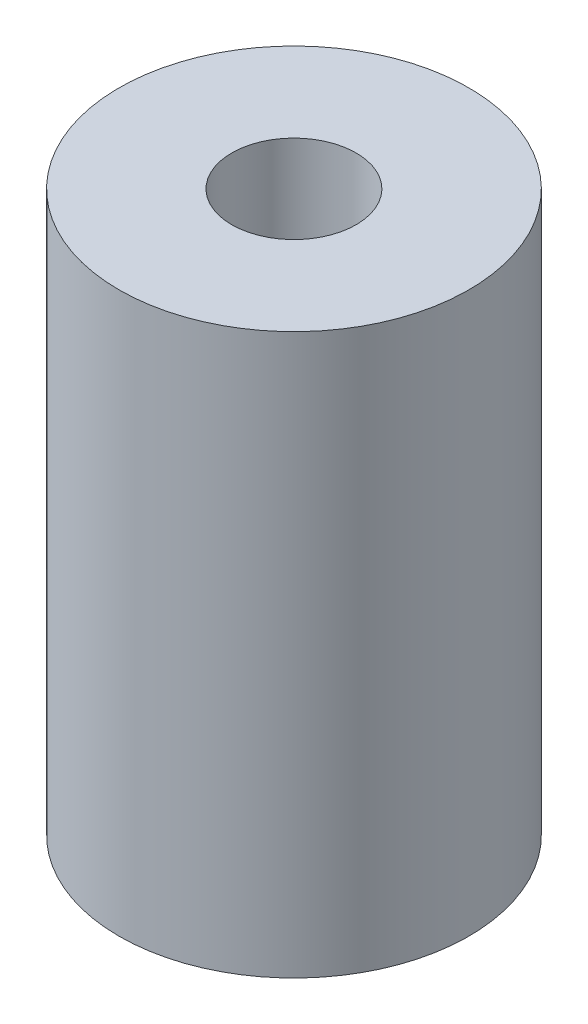
ISO-10303-21;
HEADER;
FILE_DESCRIPTION(('STEP AP214'),'2;1');
FILE_NAME('part.step','',(''),(''),'','','');
FILE_SCHEMA(('AUTOMOTIVE_DESIGN { 1 0 10303 214 1 1 1 1 }'));
ENDSEC;
DATA;
#1=APPLICATION_CONTEXT('core data for automotive mechanical design processes');
#2=APPLICATION_PROTOCOL_DEFINITION('international standard','automotive_design',2000,#1);
#3=PRODUCT_CONTEXT('',#1,'mechanical');
#4=PRODUCT('Part','Part','',(#3));
#5=PRODUCT_RELATED_PRODUCT_CATEGORY('part','',(#4));
#6=PRODUCT_DEFINITION_FORMATION('','',#4);
#7=PRODUCT_DEFINITION_CONTEXT('part definition',#1,'design');
#8=PRODUCT_DEFINITION('design','',#6,#7);
#9=PRODUCT_DEFINITION_SHAPE('','',#8);
#10=(LENGTH_UNIT() NAMED_UNIT(*) SI_UNIT(.MILLI.,.METRE.));
#11=(NAMED_UNIT(*) PLANE_ANGLE_UNIT() SI_UNIT($,.RADIAN.));
#12=(NAMED_UNIT(*) SI_UNIT($,.STERADIAN.) SOLID_ANGLE_UNIT());
#13=UNCERTAINTY_MEASURE_WITH_UNIT(LENGTH_MEASURE(1.E-05),#10,'distance_accuracy_value','');
#14=(GEOMETRIC_REPRESENTATION_CONTEXT(3) GLOBAL_UNCERTAINTY_ASSIGNED_CONTEXT((#13)) GLOBAL_UNIT_ASSIGNED_CONTEXT((#10,
#11,#12)) REPRESENTATION_CONTEXT('',''));
#15=CARTESIAN_POINT('',(0.,0.,0.));
#16=DIRECTION('',(0.,0.,1.));
#17=DIRECTION('',(1.,0.,0.));
#18=AXIS2_PLACEMENT_3D('',#15,#16,#17);
#19=CARTESIAN_POINT('',(0.,14.4,0.));
#20=DIRECTION('',(0.,1.,0.));
#21=DIRECTION('',(0.,0.,1.));
#22=AXIS2_PLACEMENT_3D('',#19,#20,#21);
#23=PLANE('',#22);
#24=CARTESIAN_POINT('',(0.,14.4,0.));
#25=DIRECTION('',(0.,1.,0.));
#26=DIRECTION('',(0.,0.,1.));
#27=AXIS2_PLACEMENT_3D('',#24,#25,#26);
#28=CIRCLE('',#27,4.5);
#29=CARTESIAN_POINT('',(0.,14.4,4.5));
#30=VERTEX_POINT('',#29);
#31=EDGE_CURVE('E10',#30,#30,#28,.T.);
#32=ORIENTED_EDGE('',*,*,#31,.T.);
#33=EDGE_LOOP('',(#32));
#34=FACE_BOUND('',#33,.T.);
#35=CARTESIAN_POINT('',(0.,14.4,0.));
#36=DIRECTION('',(0.,1.,0.));
#37=DIRECTION('',(0.,0.,1.));
#38=AXIS2_PLACEMENT_3D('',#35,#36,#37);
#39=CIRCLE('',#38,1.6);
#40=CARTESIAN_POINT('',(0.,14.4,1.6));
#41=VERTEX_POINT('',#40);
#42=EDGE_CURVE('E48',#41,#41,#39,.T.);
#43=ORIENTED_EDGE('',*,*,#42,.F.);
#44=EDGE_LOOP('',(#43));
#45=FACE_BOUND('',#44,.T.);
#46=ADVANCED_FACE('F37',(#34,#45),#23,.T.);
#47=CARTESIAN_POINT('',(0.,0.,0.));
#48=DIRECTION('',(0.,1.,0.));
#49=DIRECTION('',(0.,0.,1.));
#50=AXIS2_PLACEMENT_3D('',#47,#48,#49);
#51=PLANE('',#50);
#52=CARTESIAN_POINT('',(0.,0.,0.));
#53=DIRECTION('',(0.,1.,0.));
#54=DIRECTION('',(0.,0.,1.));
#55=AXIS2_PLACEMENT_3D('',#52,#53,#54);
#56=CIRCLE('',#55,4.5);
#57=CARTESIAN_POINT('',(0.,0.,4.5));
#58=VERTEX_POINT('',#57);
#59=EDGE_CURVE('E41',#58,#58,#56,.T.);
#60=ORIENTED_EDGE('',*,*,#59,.F.);
#61=EDGE_LOOP('',(#60));
#62=FACE_BOUND('',#61,.T.);
#63=CARTESIAN_POINT('',(0.,0.,0.));
#64=DIRECTION('',(0.,1.,0.));
#65=DIRECTION('',(0.,0.,1.));
#66=AXIS2_PLACEMENT_3D('',#63,#64,#65);
#67=CIRCLE('',#66,1.6);
#68=CARTESIAN_POINT('',(0.,0.,1.6));
#69=VERTEX_POINT('',#68);
#70=EDGE_CURVE('E50',#69,#69,#67,.T.);
#71=ORIENTED_EDGE('',*,*,#70,.T.);
#72=EDGE_LOOP('',(#71));
#73=FACE_BOUND('',#72,.T.);
#74=ADVANCED_FACE('F60',(#62,#73),#51,.F.);
#75=CARTESIAN_POINT('',(0.,14.4,0.));
#76=DIRECTION('',(0.,-1.,0.));
#77=DIRECTION('',(0.,0.,-1.));
#78=AXIS2_PLACEMENT_3D('',#75,#76,#77);
#79=CYLINDRICAL_SURFACE('',#78,4.5);
#80=ORIENTED_EDGE('',*,*,#31,.F.);
#81=EDGE_LOOP('',(#80));
#82=FACE_BOUND('',#81,.T.);
#83=ORIENTED_EDGE('',*,*,#59,.T.);
#84=EDGE_LOOP('',(#83));
#85=FACE_BOUND('',#84,.T.);
#86=ADVANCED_FACE('F39',(#82,#85),#79,.T.);
#87=CARTESIAN_POINT('',(0.,14.4,0.));
#88=DIRECTION('',(0.,-1.,0.));
#89=DIRECTION('',(0.,0.,-1.));
#90=AXIS2_PLACEMENT_3D('',#87,#88,#89);
#91=CYLINDRICAL_SURFACE('',#90,1.6);
#92=ORIENTED_EDGE('',*,*,#42,.T.);
#93=EDGE_LOOP('',(#92));
#94=FACE_BOUND('',#93,.T.);
#95=ORIENTED_EDGE('',*,*,#70,.F.);
#96=EDGE_LOOP('',(#95));
#97=FACE_BOUND('',#96,.T.);
#98=ADVANCED_FACE('F56',(#94,#97),#91,.F.);
#99=CLOSED_SHELL('',(#46,#74,#86,#98));
#100=MANIFOLD_SOLID_BREP('B2',#99);
#101=ADVANCED_BREP_SHAPE_REPRESENTATION('',(#18,#100),#14);
#102=SHAPE_DEFINITION_REPRESENTATION(#9,#101);
ENDSEC;
END-ISO-10303-21;
